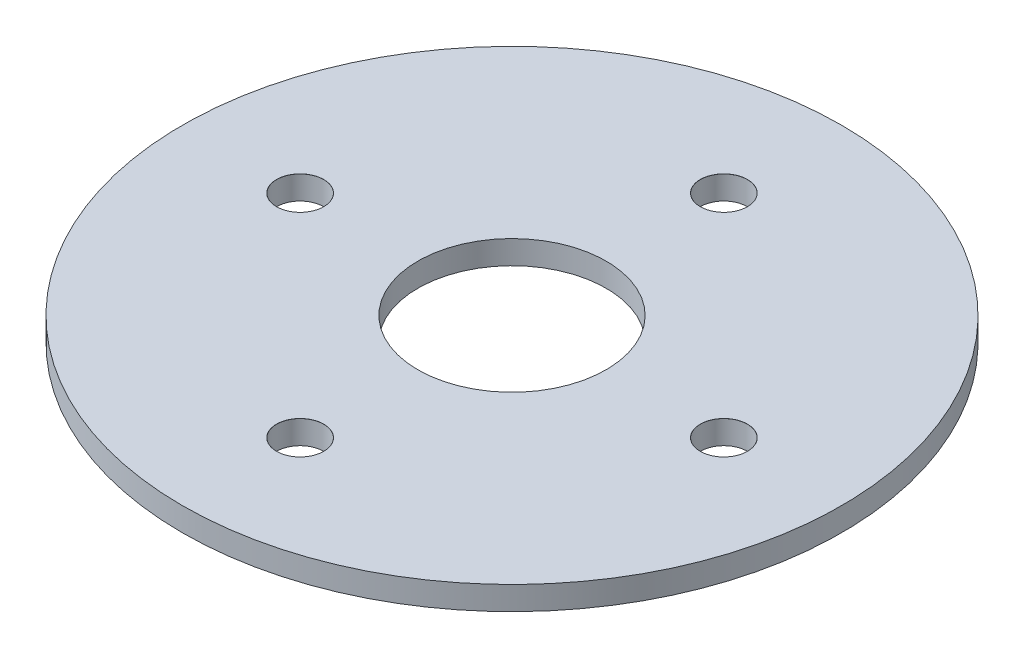
ISO-10303-21;
HEADER;
FILE_DESCRIPTION(('STEP AP214'),'2;1');
FILE_NAME('part.step','',(''),(''),'','','');
FILE_SCHEMA(('AUTOMOTIVE_DESIGN { 1 0 10303 214 1 1 1 1 }'));
ENDSEC;
DATA;
#1=APPLICATION_CONTEXT('core data for automotive mechanical design processes');
#2=APPLICATION_PROTOCOL_DEFINITION('international standard','automotive_design',2000,#1);
#3=PRODUCT_CONTEXT('',#1,'mechanical');
#4=PRODUCT('Part','Part','',(#3));
#5=PRODUCT_RELATED_PRODUCT_CATEGORY('part','',(#4));
#6=PRODUCT_DEFINITION_FORMATION('','',#4);
#7=PRODUCT_DEFINITION_CONTEXT('part definition',#1,'design');
#8=PRODUCT_DEFINITION('design','',#6,#7);
#9=PRODUCT_DEFINITION_SHAPE('','',#8);
#10=(LENGTH_UNIT() NAMED_UNIT(*) SI_UNIT(.MILLI.,.METRE.));
#11=(NAMED_UNIT(*) PLANE_ANGLE_UNIT() SI_UNIT($,.RADIAN.));
#12=(NAMED_UNIT(*) SI_UNIT($,.STERADIAN.) SOLID_ANGLE_UNIT());
#13=UNCERTAINTY_MEASURE_WITH_UNIT(LENGTH_MEASURE(1.E-05),#10,'distance_accuracy_value','');
#14=(GEOMETRIC_REPRESENTATION_CONTEXT(3) GLOBAL_UNCERTAINTY_ASSIGNED_CONTEXT((#13)) GLOBAL_UNIT_ASSIGNED_CONTEXT((#10,
#11,#12)) REPRESENTATION_CONTEXT('',''));
#15=CARTESIAN_POINT('',(0.,0.,0.));
#16=DIRECTION('',(0.,0.,1.));
#17=DIRECTION('',(1.,0.,0.));
#18=AXIS2_PLACEMENT_3D('',#15,#16,#17);
#19=CARTESIAN_POINT('',(0.,10.,0.));
#20=DIRECTION('',(0.,1.,0.));
#21=DIRECTION('',(0.,0.,1.));
#22=AXIS2_PLACEMENT_3D('',#19,#20,#21);
#23=PLANE('',#22);
#24=CARTESIAN_POINT('',(90.,10.,0.));
#25=DIRECTION('',(0.,1.,0.));
#26=DIRECTION('',(0.,0.,1.));
#27=AXIS2_PLACEMENT_3D('',#24,#25,#26);
#28=CIRCLE('',#27,10.025);
#29=CARTESIAN_POINT('',(90.,10.,10.025));
#30=VERTEX_POINT('',#29);
#31=EDGE_CURVE('E107',#30,#30,#28,.T.);
#32=ORIENTED_EDGE('',*,*,#31,.F.);
#33=EDGE_LOOP('',(#32));
#34=FACE_BOUND('',#33,.T.);
#35=CARTESIAN_POINT('',(0.,10.,-90.));
#36=DIRECTION('',(0.,1.,0.));
#37=DIRECTION('',(0.,0.,1.));
#38=AXIS2_PLACEMENT_3D('',#35,#36,#37);
#39=CIRCLE('',#38,10.025);
#40=CARTESIAN_POINT('',(0.,10.,-79.975));
#41=VERTEX_POINT('',#40);
#42=EDGE_CURVE('E95',#41,#41,#39,.T.);
#43=ORIENTED_EDGE('',*,*,#42,.F.);
#44=EDGE_LOOP('',(#43));
#45=FACE_BOUND('',#44,.T.);
#46=CARTESIAN_POINT('',(-90.,10.,0.));
#47=DIRECTION('',(0.,1.,0.));
#48=DIRECTION('',(0.,0.,1.));
#49=AXIS2_PLACEMENT_3D('',#46,#47,#48);
#50=CIRCLE('',#49,10.025);
#51=CARTESIAN_POINT('',(-90.,10.,10.025));
#52=VERTEX_POINT('',#51);
#53=EDGE_CURVE('E83',#52,#52,#50,.T.);
#54=ORIENTED_EDGE('',*,*,#53,.F.);
#55=EDGE_LOOP('',(#54));
#56=FACE_BOUND('',#55,.T.);
#57=CARTESIAN_POINT('',(0.,10.,90.));
#58=DIRECTION('',(0.,1.,0.));
#59=DIRECTION('',(0.,0.,1.));
#60=AXIS2_PLACEMENT_3D('',#57,#58,#59);
#61=CIRCLE('',#60,10.025);
#62=CARTESIAN_POINT('',(0.,10.,100.025));
#63=VERTEX_POINT('',#62);
#64=EDGE_CURVE('E71',#63,#63,#61,.T.);
#65=ORIENTED_EDGE('',*,*,#64,.F.);
#66=EDGE_LOOP('',(#65));
#67=FACE_BOUND('',#66,.T.);
#68=CARTESIAN_POINT('',(0.,10.,0.));
#69=DIRECTION('',(0.,1.,0.));
#70=DIRECTION('',(0.,0.,1.));
#71=AXIS2_PLACEMENT_3D('',#68,#69,#70);
#72=CIRCLE('',#71,140.);
#73=CARTESIAN_POINT('',(0.,10.,140.));
#74=VERTEX_POINT('',#73);
#75=EDGE_CURVE('E10',#74,#74,#72,.T.);
#76=ORIENTED_EDGE('',*,*,#75,.T.);
#77=EDGE_LOOP('',(#76));
#78=FACE_BOUND('',#77,.T.);
#79=CARTESIAN_POINT('',(0.,10.,0.));
#80=DIRECTION('',(0.,1.,0.));
#81=DIRECTION('',(0.,0.,1.));
#82=AXIS2_PLACEMENT_3D('',#79,#80,#81);
#83=CIRCLE('',#82,40.);
#84=CARTESIAN_POINT('',(0.,10.,40.));
#85=VERTEX_POINT('',#84);
#86=EDGE_CURVE('E54',#85,#85,#83,.T.);
#87=ORIENTED_EDGE('',*,*,#86,.F.);
#88=EDGE_LOOP('',(#87));
#89=FACE_BOUND('',#88,.T.);
#90=ADVANCED_FACE('F41',(#34,#45,#56,#67,#78,#89),#23,.T.);
#91=CARTESIAN_POINT('',(0.,0.,0.));
#92=DIRECTION('',(0.,1.,0.));
#93=DIRECTION('',(0.,0.,1.));
#94=AXIS2_PLACEMENT_3D('',#91,#92,#93);
#95=PLANE('',#94);
#96=CARTESIAN_POINT('',(90.,0.,0.));
#97=DIRECTION('',(0.,1.,0.));
#98=DIRECTION('',(0.,0.,1.));
#99=AXIS2_PLACEMENT_3D('',#96,#97,#98);
#100=CIRCLE('',#99,9.99999999999999);
#101=CARTESIAN_POINT('',(90.,0.,9.99999999999999));
#102=VERTEX_POINT('',#101);
#103=EDGE_CURVE('E99',#102,#102,#100,.T.);
#104=ORIENTED_EDGE('',*,*,#103,.T.);
#105=EDGE_LOOP('',(#104));
#106=FACE_BOUND('',#105,.T.);
#107=CARTESIAN_POINT('',(0.,0.,-90.));
#108=DIRECTION('',(0.,1.,0.));
#109=DIRECTION('',(0.,0.,1.));
#110=AXIS2_PLACEMENT_3D('',#107,#108,#109);
#111=CIRCLE('',#110,10.);
#112=CARTESIAN_POINT('',(0.,0.,-80.));
#113=VERTEX_POINT('',#112);
#114=EDGE_CURVE('E87',#113,#113,#111,.T.);
#115=ORIENTED_EDGE('',*,*,#114,.T.);
#116=EDGE_LOOP('',(#115));
#117=FACE_BOUND('',#116,.T.);
#118=CARTESIAN_POINT('',(-90.,0.,0.));
#119=DIRECTION('',(0.,1.,0.));
#120=DIRECTION('',(0.,0.,1.));
#121=AXIS2_PLACEMENT_3D('',#118,#119,#120);
#122=CIRCLE('',#121,9.99999999999999);
#123=CARTESIAN_POINT('',(-90.,0.,9.99999999999999));
#124=VERTEX_POINT('',#123);
#125=EDGE_CURVE('E75',#124,#124,#122,.T.);
#126=ORIENTED_EDGE('',*,*,#125,.T.);
#127=EDGE_LOOP('',(#126));
#128=FACE_BOUND('',#127,.T.);
#129=CARTESIAN_POINT('',(0.,0.,90.));
#130=DIRECTION('',(0.,1.,0.));
#131=DIRECTION('',(0.,0.,1.));
#132=AXIS2_PLACEMENT_3D('',#129,#130,#131);
#133=CIRCLE('',#132,10.);
#134=CARTESIAN_POINT('',(0.,0.,100.));
#135=VERTEX_POINT('',#134);
#136=EDGE_CURVE('E60',#135,#135,#133,.T.);
#137=ORIENTED_EDGE('',*,*,#136,.T.);
#138=EDGE_LOOP('',(#137));
#139=FACE_BOUND('',#138,.T.);
#140=CARTESIAN_POINT('',(0.,0.,0.));
#141=DIRECTION('',(0.,1.,0.));
#142=DIRECTION('',(0.,0.,1.));
#143=AXIS2_PLACEMENT_3D('',#140,#141,#142);
#144=CIRCLE('',#143,140.);
#145=CARTESIAN_POINT('',(0.,0.,140.));
#146=VERTEX_POINT('',#145);
#147=EDGE_CURVE('E45',#146,#146,#144,.T.);
#148=ORIENTED_EDGE('',*,*,#147,.F.);
#149=EDGE_LOOP('',(#148));
#150=FACE_BOUND('',#149,.T.);
#151=CARTESIAN_POINT('',(0.,0.,0.));
#152=DIRECTION('',(0.,1.,0.));
#153=DIRECTION('',(0.,0.,1.));
#154=AXIS2_PLACEMENT_3D('',#151,#152,#153);
#155=CIRCLE('',#154,40.);
#156=CARTESIAN_POINT('',(0.,0.,40.));
#157=VERTEX_POINT('',#156);
#158=EDGE_CURVE('E56',#157,#157,#155,.T.);
#159=ORIENTED_EDGE('',*,*,#158,.T.);
#160=EDGE_LOOP('',(#159));
#161=FACE_BOUND('',#160,.T.);
#162=ADVANCED_FACE('F116',(#106,#117,#128,#139,#150,#161),#95,.F.);
#163=CARTESIAN_POINT('',(0.,10.,0.));
#164=DIRECTION('',(0.,-1.,0.));
#165=DIRECTION('',(0.,0.,-1.));
#166=AXIS2_PLACEMENT_3D('',#163,#164,#165);
#167=CYLINDRICAL_SURFACE('',#166,140.);
#168=ORIENTED_EDGE('',*,*,#75,.F.);
#169=EDGE_LOOP('',(#168));
#170=FACE_BOUND('',#169,.T.);
#171=ORIENTED_EDGE('',*,*,#147,.T.);
#172=EDGE_LOOP('',(#171));
#173=FACE_BOUND('',#172,.T.);
#174=ADVANCED_FACE('F43',(#170,#173),#167,.T.);
#175=CARTESIAN_POINT('',(0.,10.,0.));
#176=DIRECTION('',(0.,-1.,0.));
#177=DIRECTION('',(0.,0.,-1.));
#178=AXIS2_PLACEMENT_3D('',#175,#176,#177);
#179=CYLINDRICAL_SURFACE('',#178,40.);
#180=ORIENTED_EDGE('',*,*,#86,.T.);
#181=EDGE_LOOP('',(#180));
#182=FACE_BOUND('',#181,.T.);
#183=ORIENTED_EDGE('',*,*,#158,.F.);
#184=EDGE_LOOP('',(#183));
#185=FACE_BOUND('',#184,.T.);
#186=ADVANCED_FACE('F126',(#182,#185),#179,.F.);
#187=CARTESIAN_POINT('',(0.,10.,90.));
#188=DIRECTION('',(0.,1.,0.));
#189=DIRECTION('',(0.,0.,1.));
#190=AXIS2_PLACEMENT_3D('',#187,#188,#189);
#191=CYLINDRICAL_SURFACE('',#190,10.);
#192=ORIENTED_EDGE('',*,*,#136,.F.);
#193=EDGE_LOOP('',(#192));
#194=FACE_BOUND('',#193,.T.);
#195=CARTESIAN_POINT('',(0.,9.97499999999999,90.));
#196=DIRECTION('',(0.,1.,0.));
#197=DIRECTION('',(0.,0.,1.));
#198=AXIS2_PLACEMENT_3D('',#195,#196,#197);
#199=CIRCLE('',#198,10.);
#200=CARTESIAN_POINT('',(0.,9.97499999999999,100.));
#201=VERTEX_POINT('',#200);
#202=EDGE_CURVE('E67',#201,#201,#199,.T.);
#203=ORIENTED_EDGE('',*,*,#202,.T.);
#204=EDGE_LOOP('',(#203));
#205=FACE_BOUND('',#204,.T.);
#206=ADVANCED_FACE('F129',(#194,#205),#191,.F.);
#207=CARTESIAN_POINT('',(0.,10.,90.));
#208=DIRECTION('',(0.,1.,0.));
#209=DIRECTION('',(0.,0.,1.));
#210=AXIS2_PLACEMENT_3D('',#207,#208,#209);
#211=CONICAL_SURFACE('',#210,10.025,0.785398163397379);
#212=ORIENTED_EDGE('',*,*,#202,.F.);
#213=EDGE_LOOP('',(#212));
#214=FACE_BOUND('',#213,.T.);
#215=ORIENTED_EDGE('',*,*,#64,.T.);
#216=EDGE_LOOP('',(#215));
#217=FACE_BOUND('',#216,.T.);
#218=ADVANCED_FACE('F143',(#214,#217),#211,.F.);
#219=CARTESIAN_POINT('',(-90.,10.,0.));
#220=DIRECTION('',(0.,1.,0.));
#221=DIRECTION('',(0.,0.,1.));
#222=AXIS2_PLACEMENT_3D('',#219,#220,#221);
#223=CYLINDRICAL_SURFACE('',#222,9.99999999999999);
#224=ORIENTED_EDGE('',*,*,#125,.F.);
#225=EDGE_LOOP('',(#224));
#226=FACE_BOUND('',#225,.T.);
#227=CARTESIAN_POINT('',(-90.,9.97499999999999,0.));
#228=DIRECTION('',(0.,1.,0.));
#229=DIRECTION('',(0.,0.,1.));
#230=AXIS2_PLACEMENT_3D('',#227,#228,#229);
#231=CIRCLE('',#230,9.99999999999999);
#232=CARTESIAN_POINT('',(-90.,9.97499999999999,9.99999999999999));
#233=VERTEX_POINT('',#232);
#234=EDGE_CURVE('E79',#233,#233,#231,.T.);
#235=ORIENTED_EDGE('',*,*,#234,.T.);
#236=EDGE_LOOP('',(#235));
#237=FACE_BOUND('',#236,.T.);
#238=ADVANCED_FACE('F147',(#226,#237),#223,.F.);
#239=CARTESIAN_POINT('',(-90.,10.,0.));
#240=DIRECTION('',(0.,1.,0.));
#241=DIRECTION('',(0.,0.,1.));
#242=AXIS2_PLACEMENT_3D('',#239,#240,#241);
#243=CONICAL_SURFACE('',#242,10.025,0.785398163397518);
#244=ORIENTED_EDGE('',*,*,#234,.F.);
#245=EDGE_LOOP('',(#244));
#246=FACE_BOUND('',#245,.T.);
#247=ORIENTED_EDGE('',*,*,#53,.T.);
#248=EDGE_LOOP('',(#247));
#249=FACE_BOUND('',#248,.T.);
#250=ADVANCED_FACE('F151',(#246,#249),#243,.F.);
#251=CARTESIAN_POINT('',(0.,10.,-90.));
#252=DIRECTION('',(0.,1.,0.));
#253=DIRECTION('',(0.,0.,1.));
#254=AXIS2_PLACEMENT_3D('',#251,#252,#253);
#255=CYLINDRICAL_SURFACE('',#254,10.);
#256=ORIENTED_EDGE('',*,*,#114,.F.);
#257=EDGE_LOOP('',(#256));
#258=FACE_BOUND('',#257,.T.);
#259=CARTESIAN_POINT('',(0.,9.97499999999999,-90.));
#260=DIRECTION('',(0.,1.,0.));
#261=DIRECTION('',(0.,0.,1.));
#262=AXIS2_PLACEMENT_3D('',#259,#260,#261);
#263=CIRCLE('',#262,10.);
#264=CARTESIAN_POINT('',(0.,9.97499999999999,-80.));
#265=VERTEX_POINT('',#264);
#266=EDGE_CURVE('E91',#265,#265,#263,.T.);
#267=ORIENTED_EDGE('',*,*,#266,.T.);
#268=EDGE_LOOP('',(#267));
#269=FACE_BOUND('',#268,.T.);
#270=ADVANCED_FACE('F155',(#258,#269),#255,.F.);
#271=CARTESIAN_POINT('',(0.,10.,-90.));
#272=DIRECTION('',(0.,1.,0.));
#273=DIRECTION('',(0.,0.,1.));
#274=AXIS2_PLACEMENT_3D('',#271,#272,#273);
#275=CONICAL_SURFACE('',#274,10.025,0.785398163397379);
#276=ORIENTED_EDGE('',*,*,#266,.F.);
#277=EDGE_LOOP('',(#276));
#278=FACE_BOUND('',#277,.T.);
#279=ORIENTED_EDGE('',*,*,#42,.T.);
#280=EDGE_LOOP('',(#279));
#281=FACE_BOUND('',#280,.T.);
#282=ADVANCED_FACE('F159',(#278,#281),#275,.F.);
#283=CARTESIAN_POINT('',(90.,10.,0.));
#284=DIRECTION('',(0.,1.,0.));
#285=DIRECTION('',(0.,0.,1.));
#286=AXIS2_PLACEMENT_3D('',#283,#284,#285);
#287=CYLINDRICAL_SURFACE('',#286,9.99999999999999);
#288=ORIENTED_EDGE('',*,*,#103,.F.);
#289=EDGE_LOOP('',(#288));
#290=FACE_BOUND('',#289,.T.);
#291=CARTESIAN_POINT('',(90.,9.97499999999999,0.));
#292=DIRECTION('',(0.,1.,0.));
#293=DIRECTION('',(0.,0.,1.));
#294=AXIS2_PLACEMENT_3D('',#291,#292,#293);
#295=CIRCLE('',#294,9.99999999999999);
#296=CARTESIAN_POINT('',(90.,9.97499999999999,9.99999999999999));
#297=VERTEX_POINT('',#296);
#298=EDGE_CURVE('E103',#297,#297,#295,.T.);
#299=ORIENTED_EDGE('',*,*,#298,.T.);
#300=EDGE_LOOP('',(#299));
#301=FACE_BOUND('',#300,.T.);
#302=ADVANCED_FACE('F163',(#290,#301),#287,.F.);
#303=CARTESIAN_POINT('',(90.,10.,0.));
#304=DIRECTION('',(0.,1.,0.));
#305=DIRECTION('',(0.,0.,1.));
#306=AXIS2_PLACEMENT_3D('',#303,#304,#305);
#307=CONICAL_SURFACE('',#306,10.025,0.785398163397518);
#308=ORIENTED_EDGE('',*,*,#298,.F.);
#309=EDGE_LOOP('',(#308));
#310=FACE_BOUND('',#309,.T.);
#311=ORIENTED_EDGE('',*,*,#31,.T.);
#312=EDGE_LOOP('',(#311));
#313=FACE_BOUND('',#312,.T.);
#314=ADVANCED_FACE('F112',(#310,#313),#307,.F.);
#315=CLOSED_SHELL('',(#90,#162,#174,#186,#206,#218,#238,#250,#270,#282,#302,#314));
#316=MANIFOLD_SOLID_BREP('B2',#315);
#317=ADVANCED_BREP_SHAPE_REPRESENTATION('',(#18,#316),#14);
#318=SHAPE_DEFINITION_REPRESENTATION(#9,#317);
ENDSEC;
END-ISO-10303-21;
